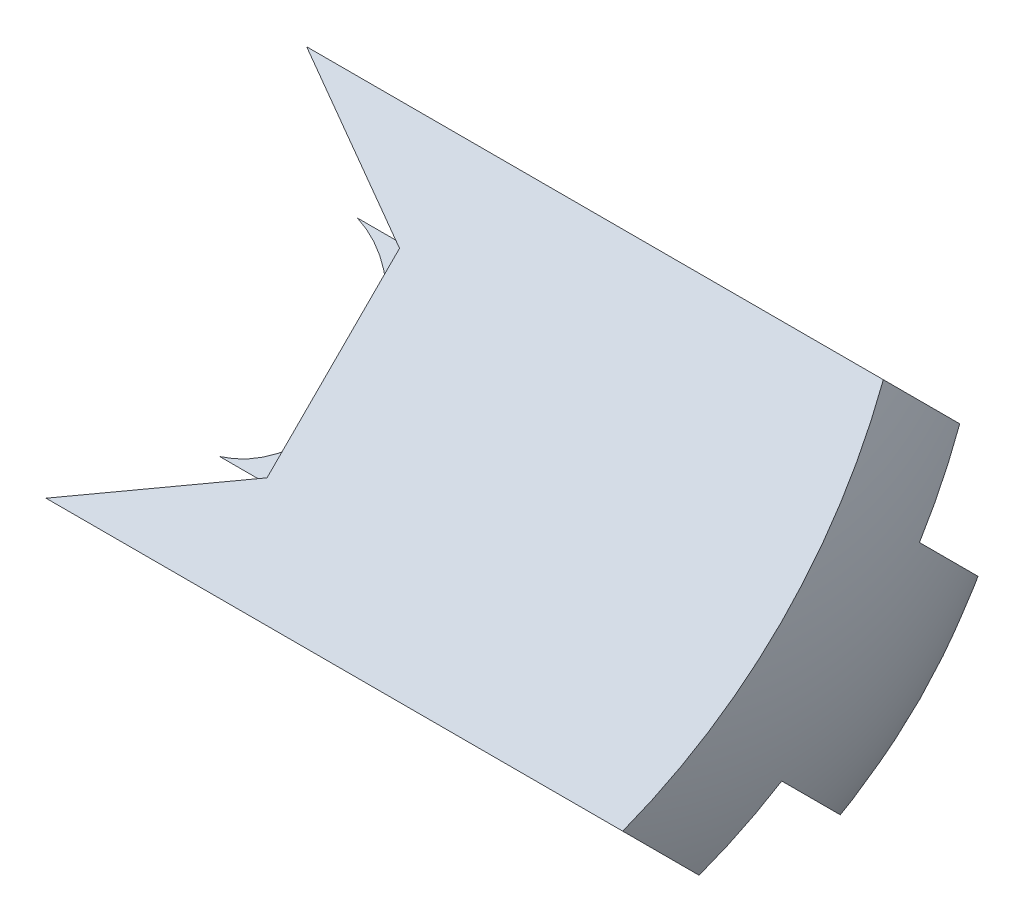
ISO-10303-21;
HEADER;
FILE_DESCRIPTION(('STEP AP214'),'2;1');
FILE_NAME('part.step','',(''),(''),'','','');
FILE_SCHEMA(('AUTOMOTIVE_DESIGN { 1 0 10303 214 1 1 1 1 }'));
ENDSEC;
DATA;
#1=APPLICATION_CONTEXT('core data for automotive mechanical design processes');
#2=APPLICATION_PROTOCOL_DEFINITION('international standard','automotive_design',2000,#1);
#3=PRODUCT_CONTEXT('',#1,'mechanical');
#4=PRODUCT('Part','Part','',(#3));
#5=PRODUCT_RELATED_PRODUCT_CATEGORY('part','',(#4));
#6=PRODUCT_DEFINITION_FORMATION('','',#4);
#7=PRODUCT_DEFINITION_CONTEXT('part definition',#1,'design');
#8=PRODUCT_DEFINITION('design','',#6,#7);
#9=PRODUCT_DEFINITION_SHAPE('','',#8);
#10=(LENGTH_UNIT() NAMED_UNIT(*) SI_UNIT(.MILLI.,.METRE.));
#11=(NAMED_UNIT(*) PLANE_ANGLE_UNIT() SI_UNIT($,.RADIAN.));
#12=(NAMED_UNIT(*) SI_UNIT($,.STERADIAN.) SOLID_ANGLE_UNIT());
#13=UNCERTAINTY_MEASURE_WITH_UNIT(LENGTH_MEASURE(1.E-05),#10,'distance_accuracy_value','');
#14=(GEOMETRIC_REPRESENTATION_CONTEXT(3) GLOBAL_UNCERTAINTY_ASSIGNED_CONTEXT((#13)) GLOBAL_UNIT_ASSIGNED_CONTEXT((#10,
#11,#12)) REPRESENTATION_CONTEXT('',''));
#15=CARTESIAN_POINT('',(0.,0.,0.));
#16=DIRECTION('',(0.,0.,1.));
#17=DIRECTION('',(1.,0.,0.));
#18=AXIS2_PLACEMENT_3D('',#15,#16,#17);
#19=CARTESIAN_POINT('',(-65.,-21.4342694425522,-76.0704710401193));
#20=DIRECTION('',(0.,1.,0.));
#21=DIRECTION('',(0.,0.,1.));
#22=AXIS2_PLACEMENT_3D('',#19,#20,#21);
#23=SPHERICAL_SURFACE('',#22,19.75);
#24=CARTESIAN_POINT('',(-65.,-19.2068830818146,-78.2978574008569));
#25=DIRECTION('',(0.,-0.707106781186544,0.707106781186551));
#26=DIRECTION('',(0.,-0.707106781186551,-0.707106781186544));
#27=AXIS2_PLACEMENT_3D('',#24,#25,#26);
#28=CIRCLE('',#27,19.4971792831681);
#29=CARTESIAN_POINT('',(-45.9496063032808,-22.1413762237388,-81.2323505427811));
#30=VERTEX_POINT('',#29);
#31=CARTESIAN_POINT('',(-62.8725245130072,-32.9111497176519,-92.0021240366941));
#32=VERTEX_POINT('',#31);
#33=EDGE_CURVE('E196',#30,#32,#28,.F.);
#34=ORIENTED_EDGE('',*,*,#33,.F.);
#35=CARTESIAN_POINT('',(-65.,-24.3687625844764,-79.0049641820434));
#36=DIRECTION('',(0.,0.707106781186554,0.707106781186541));
#37=DIRECTION('',(0.,-0.707106781186541,0.707106781186554));
#38=AXIS2_PLACEMENT_3D('',#35,#36,#37);
#39=CIRCLE('',#38,19.3090652285397);
#40=CARTESIAN_POINT('',(-46.6344769863394,-20.1528662127245,-83.2208605537954));
#41=VERTEX_POINT('',#40);
#42=EDGE_CURVE('E240',#41,#30,#39,.F.);
#43=ORIENTED_EDGE('',*,*,#42,.F.);
#44=CARTESIAN_POINT('',(-65.,-17.2183730708003,-80.2863674118712));
#45=DIRECTION('',(0.,-0.707106781186543,0.707106781186552));
#46=DIRECTION('',(0.,-0.707106781186552,-0.707106781186543));
#47=AXIS2_PLACEMENT_3D('',#44,#45,#46);
#48=CIRCLE('',#47,18.8285670077491);
#49=CARTESIAN_POINT('',(-46.1714329922509,-17.2183730708004,-80.2863674118712));
#50=VERTEX_POINT('',#49);
#51=EDGE_CURVE('E148',#50,#41,#48,.F.);
#52=ORIENTED_EDGE('',*,*,#51,.F.);
#53=CARTESIAN_POINT('',(-65.,-21.4342694425522,-76.0704710401193));
#54=DIRECTION('',(0.,0.707106781186551,0.707106781186544));
#55=DIRECTION('',(0.,-0.707106781186544,0.707106781186551));
#56=AXIS2_PLACEMENT_3D('',#53,#54,#55);
#57=CIRCLE('',#56,19.75);
#58=CARTESIAN_POINT('',(-46.1714329922509,-25.6501658143042,-71.8545746683674));
#59=VERTEX_POINT('',#58);
#60=EDGE_CURVE('E130',#50,#59,#57,.F.);
#61=ORIENTED_EDGE('',*,*,#60,.T.);
#62=CARTESIAN_POINT('',(-65.,-25.6501658143043,-71.8545746683676));
#63=DIRECTION('',(0.,0.707106781186582,-0.707106781186513));
#64=DIRECTION('',(0.,0.707106781186513,0.707106781186582));
#65=AXIS2_PLACEMENT_3D('',#62,#63,#64);
#66=CIRCLE('',#65,18.8285670077491);
#67=CARTESIAN_POINT('',(-46.6344769863394,-28.5846589562283,-74.7890678102915));
#68=VERTEX_POINT('',#67);
#69=EDGE_CURVE('E137',#68,#59,#66,.F.);
#70=ORIENTED_EDGE('',*,*,#69,.F.);
#71=CARTESIAN_POINT('',(-65.,-24.3687625844764,-79.0049641820435));
#72=DIRECTION('',(0.,0.70710678118655,0.707106781186545));
#73=DIRECTION('',(0.,-0.707106781186545,0.70710678118655));
#74=AXIS2_PLACEMENT_3D('',#71,#72,#73);
#75=CIRCLE('',#74,19.3090652285397);
#76=CARTESIAN_POINT('',(-45.9496063032808,-26.596148945214,-76.7775778213058));
#77=VERTEX_POINT('',#76);
#78=EDGE_CURVE('E194',#77,#68,#75,.F.);
#79=ORIENTED_EDGE('',*,*,#78,.F.);
#80=CARTESIAN_POINT('',(-65.,-23.6616558032898,-73.8430846793816));
#81=DIRECTION('',(0.,0.707106781186544,-0.707106781186551));
#82=DIRECTION('',(0.,0.707106781186551,0.707106781186544));
#83=AXIS2_PLACEMENT_3D('',#80,#81,#82);
#84=CIRCLE('',#83,19.4971792831681);
#85=CARTESIAN_POINT('',(-62.8725245130072,-37.3659224391272,-87.5473513152188));
#86=VERTEX_POINT('',#85);
#87=EDGE_CURVE('E192',#86,#77,#84,.F.);
#88=ORIENTED_EDGE('',*,*,#87,.F.);
#89=CARTESIAN_POINT('',(-65.,-24.5353909583156,-73.2813832565147));
#90=DIRECTION('',(0.,0.74352318851626,-0.668710152561342));
#91=DIRECTION('',(0.,0.668710152561342,0.74352318851626));
#92=AXIS2_PLACEMENT_3D('',#89,#90,#91);
#93=CIRCLE('',#92,19.3045728955555);
#94=CARTESIAN_POINT('',(-64.1794232667012,-37.4328872203387,-87.6218078902446));
#95=VERTEX_POINT('',#94);
#96=EDGE_CURVE('E181',#95,#86,#93,.F.);
#97=ORIENTED_EDGE('',*,*,#96,.F.);
#98=CARTESIAN_POINT('',(-65.,-35.2092467565082,-89.8454483540751));
#99=DIRECTION('',(0.,-0.707106781186551,-0.707106781186544));
#100=DIRECTION('',(0.,0.707106781186544,-0.707106781186551));
#101=AXIS2_PLACEMENT_3D('',#98,#99,#100);
#102=CIRCLE('',#101,3.25000000000001);
#103=CARTESIAN_POINT('',(-64.1780969436501,-32.9858512264728,-92.0688438841105));
#104=VERTEX_POINT('',#103);
#105=EDGE_CURVE('E176',#95,#104,#102,.F.);
#106=ORIENTED_EDGE('',*,*,#105,.T.);
#107=CARTESIAN_POINT('',(-65.,-18.6117843604188,-79.2306085767642));
#108=DIRECTION('',(0.,-0.666138377099837,0.745828172272136));
#109=DIRECTION('',(0.,-0.745828172272136,-0.666138377099837));
#110=AXIS2_PLACEMENT_3D('',#107,#108,#109);
#111=CIRCLE('',#110,19.2901427861647);
#112=EDGE_CURVE('E202',#32,#104,#111,.F.);
#113=ORIENTED_EDGE('',*,*,#112,.F.);
#114=EDGE_LOOP('',(#34,#43,#52,#61,#70,#79,#88,#97,#106,#113));
#115=FACE_BOUND('',#114,.T.);
#116=ADVANCED_FACE('F35',(#115),#23,.T.);
#117=CARTESIAN_POINT('',(-65.,-41.1842694425523,-95.8204710401192));
#118=DIRECTION('',(0.,0.707106781186551,0.707106781186544));
#119=DIRECTION('',(0.,0.707106781186544,-0.707106781186551));
#120=AXIS2_PLACEMENT_3D('',#117,#118,#119);
#121=CYLINDRICAL_SURFACE('',#120,3.25000000000001);
#122=CARTESIAN_POINT('',(-65.,-74.6040037344345,-129.240205332001));
#123=DIRECTION('',(0.,-0.666138377099837,0.745828172272136));
#124=DIRECTION('',(0.,0.745828172272136,0.666138377099837));
#125=AXIS2_PLACEMENT_3D('',#122,#123,#124);
#126=ELLIPSE('',#125,57.6760684071963,3.25000000000001);
#127=CARTESIAN_POINT('',(-64.2,-32.9111497176519,-92.0021240366941));
#128=VERTEX_POINT('',#127);
#129=EDGE_CURVE('E11',#128,#104,#126,.F.);
#130=ORIENTED_EDGE('',*,*,#129,.T.);
#131=ORIENTED_EDGE('',*,*,#105,.F.);
#132=CARTESIAN_POINT('',(-65.,-77.1845410552546,-131.820742652821));
#133=DIRECTION('',(0.,0.74352318851626,-0.668710152561342));
#134=DIRECTION('',(0.,0.668710152561342,0.74352318851626));
#135=AXIS2_PLACEMENT_3D('',#132,#133,#134);
#136=ELLIPSE('',#135,61.4357380240756,3.25000000000001);
#137=CARTESIAN_POINT('',(-64.2,-37.3659224391272,-87.5473513152188));
#138=VERTEX_POINT('',#137);
#139=EDGE_CURVE('E42',#95,#138,#136,.F.);
#140=ORIENTED_EDGE('',*,*,#139,.T.);
#141=DIRECTION('',(0.,0.707106781186551,0.707106781186544));
#142=VECTOR('',#141,1.);
#143=CARTESIAN_POINT('',(-64.2,-43.4116558032899,-93.5930846793815));
#144=LINE('',#143,#142);
#145=CARTESIAN_POINT('',(-64.1999999999999,-26.6668596233327,-76.8482884994245));
#146=VERTEX_POINT('',#145);
#147=EDGE_CURVE('E174',#138,#146,#144,.T.);
#148=ORIENTED_EDGE('',*,*,#147,.T.);
#149=CARTESIAN_POINT('',(-65.,-24.4394732625951,-79.0756748601621));
#150=DIRECTION('',(0.,-0.707106781186552,-0.707106781186543));
#151=DIRECTION('',(0.,0.707106781186543,-0.707106781186552));
#152=AXIS2_PLACEMENT_3D('',#149,#150,#151);
#153=CIRCLE('',#152,3.25000000000001);
#154=CARTESIAN_POINT('',(-64.1999999999999,-22.2120869018575,-81.3030612208997));
#155=VERTEX_POINT('',#154);
#156=EDGE_CURVE('E205',#155,#146,#153,.T.);
#157=ORIENTED_EDGE('',*,*,#156,.F.);
#158=DIRECTION('',(0.,0.707106781186551,0.707106781186544));
#159=VECTOR('',#158,1.);
#160=CARTESIAN_POINT('',(-64.2,-38.9568830818147,-98.0478574008568));
#161=LINE('',#160,#159);
#162=EDGE_CURVE('E246',#155,#128,#161,.F.);
#163=ORIENTED_EDGE('',*,*,#162,.T.);
#164=EDGE_LOOP('',(#130,#131,#140,#148,#157,#163));
#165=FACE_BOUND('',#164,.T.);
#166=ADVANCED_FACE('F171',(#165),#121,.F.);
#167=CARTESIAN_POINT('',(0.,-51.7575740613788,-51.7575740613781));
#168=DIRECTION('',(0.,0.707106781186552,0.707106781186543));
#169=DIRECTION('',(0.,0.707106781186543,-0.707106781186552));
#170=AXIS2_PLACEMENT_3D('',#167,#168,#169);
#171=PLANE('',#170);
#172=ORIENTED_EDGE('',*,*,#156,.T.);
#173=DIRECTION('',(-1.,0.,0.));
#174=VECTOR('',#173,1.);
#175=CARTESIAN_POINT('',(0.,-26.6668596233327,-76.8482884994245));
#176=LINE('',#175,#174);
#177=CARTESIAN_POINT('',(-59.9559600438419,-26.6668596233327,-76.8482884994245));
#178=VERTEX_POINT('',#177);
#179=EDGE_CURVE('E190',#178,#146,#176,.T.);
#180=ORIENTED_EDGE('',*,*,#179,.F.);
#181=DIRECTION('',(-0.866025403784439,-0.353553390593271,0.353553390593277));
#182=VECTOR('',#181,1.);
#183=CARTESIAN_POINT('',(-59.75,-26.5827767875304,-76.9323713352268));
#184=LINE('',#183,#182);
#185=CARTESIAN_POINT('',(-59.75,-26.5827767875304,-76.9323713352268));
#186=VERTEX_POINT('',#185);
#187=EDGE_CURVE('E208',#186,#178,#184,.T.);
#188=ORIENTED_EDGE('',*,*,#187,.F.);
#189=DIRECTION('',(0.,-0.707106781186545,0.70710678118655));
#190=VECTOR('',#189,1.);
#191=CARTESIAN_POINT('',(-59.75,-22.2961697376598,-81.2189783850974));
#192=LINE('',#191,#190);
#193=CARTESIAN_POINT('',(-59.75,-22.2961697376598,-81.2189783850974));
#194=VERTEX_POINT('',#193);
#195=EDGE_CURVE('E215',#194,#186,#192,.T.);
#196=ORIENTED_EDGE('',*,*,#195,.F.);
#197=DIRECTION('',(0.866025403784439,-0.353553390593271,0.353553390593275));
#198=VECTOR('',#197,1.);
#199=CARTESIAN_POINT('',(-65.,-20.1528662127245,-83.3622819100327));
#200=LINE('',#199,#198);
#201=CARTESIAN_POINT('',(-59.955960043842,-22.2120869018575,-81.3030612208997));
#202=VERTEX_POINT('',#201);
#203=EDGE_CURVE('E211',#202,#194,#200,.T.);
#204=ORIENTED_EDGE('',*,*,#203,.F.);
#205=DIRECTION('',(1.,0.,0.));
#206=VECTOR('',#205,1.);
#207=CARTESIAN_POINT('',(0.,-22.2120869018575,-81.3030612208998));
#208=LINE('',#207,#206);
#209=EDGE_CURVE('E243',#155,#202,#208,.T.);
#210=ORIENTED_EDGE('',*,*,#209,.F.);
#211=EDGE_LOOP('',(#172,#180,#188,#196,#204,#210));
#212=FACE_BOUND('',#211,.T.);
#213=ADVANCED_FACE('F259',(#212),#171,.T.);
#214=CARTESIAN_POINT('',(-59.75,-26.5827767875304,-76.9323713352268));
#215=DIRECTION('',(0.5,-0.612372435695791,0.612372435695798));
#216=DIRECTION('',(0.,0.707106781186551,0.707106781186544));
#217=AXIS2_PLACEMENT_3D('',#214,#215,#216);
#218=PLANE('',#217);
#219=DIRECTION('',(0.,0.707106781186513,0.707106781186582));
#220=VECTOR('',#219,1.);
#221=CARTESIAN_POINT('',(-64.8267949192427,-28.6553696343473,-74.8597784884108));
#222=LINE('',#221,#220);
#223=CARTESIAN_POINT('',(-64.8267949192431,-28.5846589562283,-74.7890678102915));
#224=VERTEX_POINT('',#223);
#225=CARTESIAN_POINT('',(-64.8267949192431,-25.6501658143041,-71.8545746683673));
#226=VERTEX_POINT('',#225);
#227=EDGE_CURVE('E144',#224,#226,#222,.T.);
#228=ORIENTED_EDGE('',*,*,#227,.T.);
#229=DIRECTION('',(-0.866025403784439,-0.353553390593271,0.353553390593277));
#230=VECTOR('',#229,1.);
#231=CARTESIAN_POINT('',(-59.75,-23.5775729674875,-73.927167515184));
#232=LINE('',#231,#230);
#233=CARTESIAN_POINT('',(-59.75,-23.5775729674875,-73.927167515184));
#234=VERTEX_POINT('',#233);
#235=EDGE_CURVE('E133',#234,#226,#232,.T.);
#236=ORIENTED_EDGE('',*,*,#235,.F.);
#237=DIRECTION('',(0.,0.707106781186551,0.707106781186544));
#238=VECTOR('',#237,1.);
#239=CARTESIAN_POINT('',(-59.75,-26.5827767875304,-76.9323713352268));
#240=LINE('',#239,#238);
#241=EDGE_CURVE('E149',#186,#234,#240,.T.);
#242=ORIENTED_EDGE('',*,*,#241,.F.);
#243=ORIENTED_EDGE('',*,*,#187,.T.);
#244=DIRECTION('',(0.,0.707106781186551,0.707106781186544));
#245=VECTOR('',#244,1.);
#246=CARTESIAN_POINT('',(-59.9559600438419,-26.6668596233327,-76.8482884994245));
#247=LINE('',#246,#245);
#248=CARTESIAN_POINT('',(-59.9559600438419,-26.596148945214,-76.7775778213058));
#249=VERTEX_POINT('',#248);
#250=EDGE_CURVE('E162',#178,#249,#247,.T.);
#251=ORIENTED_EDGE('',*,*,#250,.T.);
#252=DIRECTION('',(-0.866025403784439,-0.353553390593273,0.353553390593275));
#253=VECTOR('',#252,1.);
#254=CARTESIAN_POINT('',(-59.75,-26.5120661094117,-76.8616606571081));
#255=LINE('',#254,#253);
#256=EDGE_CURVE('E165',#249,#224,#255,.T.);
#257=ORIENTED_EDGE('',*,*,#256,.T.);
#258=EDGE_LOOP('',(#228,#236,#242,#243,#251,#257));
#259=FACE_BOUND('',#258,.T.);
#260=ADVANCED_FACE('F229',(#259),#218,.F.);
#261=CARTESIAN_POINT('',(-65.,-20.1528662127245,-83.3622819100327));
#262=DIRECTION('',(0.499999999999999,0.612372435695791,-0.612372435695798));
#263=DIRECTION('',(0.,-0.707106781186551,-0.707106781186544));
#264=AXIS2_PLACEMENT_3D('',#261,#262,#263);
#265=PLANE('',#264);
#266=DIRECTION('',(0.,-0.707106781186551,-0.707106781186544));
#267=VECTOR('',#266,1.);
#268=CARTESIAN_POINT('',(-59.955960043842,-22.2120869018575,-81.3030612208997));
#269=LINE('',#268,#267);
#270=CARTESIAN_POINT('',(-59.955960043842,-22.1413762237388,-81.2323505427811));
#271=VERTEX_POINT('',#270);
#272=EDGE_CURVE('E160',#271,#202,#269,.T.);
#273=ORIENTED_EDGE('',*,*,#272,.T.);
#274=ORIENTED_EDGE('',*,*,#203,.T.);
#275=DIRECTION('',(0.,0.707106781186551,0.707106781186544));
#276=VECTOR('',#275,1.);
#277=CARTESIAN_POINT('',(-59.75,-22.2961697376598,-81.2189783850974));
#278=LINE('',#277,#276);
#279=CARTESIAN_POINT('',(-59.75,-19.290965917617,-78.2137745650546));
#280=VERTEX_POINT('',#279);
#281=EDGE_CURVE('E152',#194,#280,#278,.T.);
#282=ORIENTED_EDGE('',*,*,#281,.T.);
#283=DIRECTION('',(0.866025403784439,-0.353553390593271,0.353553390593275));
#284=VECTOR('',#283,1.);
#285=CARTESIAN_POINT('',(-65.,-17.1476623926817,-80.3570780899899));
#286=LINE('',#285,#284);
#287=CARTESIAN_POINT('',(-64.8267949192431,-17.2183730708004,-80.2863674118712));
#288=VERTEX_POINT('',#287);
#289=EDGE_CURVE('E219',#288,#280,#286,.T.);
#290=ORIENTED_EDGE('',*,*,#289,.F.);
#291=DIRECTION('',(0.,-0.707106781186552,-0.707106781186543));
#292=VECTOR('',#291,1.);
#293=CARTESIAN_POINT('',(-64.8267949192431,-20.2235768908432,-83.291571231914));
#294=LINE('',#293,#292);
#295=CARTESIAN_POINT('',(-64.8267949192431,-20.1528662127245,-83.2208605537954));
#296=VERTEX_POINT('',#295);
#297=EDGE_CURVE('E143',#288,#296,#294,.T.);
#298=ORIENTED_EDGE('',*,*,#297,.T.);
#299=DIRECTION('',(0.866025403784439,-0.35355339059327,0.353553390593277));
#300=VECTOR('',#299,1.);
#301=CARTESIAN_POINT('',(-65.,-20.0821555346059,-83.291571231914));
#302=LINE('',#301,#300);
#303=EDGE_CURVE('E157',#296,#271,#302,.T.);
#304=ORIENTED_EDGE('',*,*,#303,.T.);
#305=EDGE_LOOP('',(#273,#274,#282,#290,#298,#304));
#306=FACE_BOUND('',#305,.T.);
#307=ADVANCED_FACE('F261',(#306),#265,.F.);
#308=CARTESIAN_POINT('',(-45.25,-17.1476623926817,-80.3570780899899));
#309=DIRECTION('',(0.,-0.707106781186551,-0.707106781186544));
#310=DIRECTION('',(0.,-0.707106781186544,0.707106781186551));
#311=AXIS2_PLACEMENT_3D('',#308,#309,#310);
#312=PLANE('',#311);
#313=DIRECTION('',(-1.,0.,0.));
#314=VECTOR('',#313,1.);
#315=CARTESIAN_POINT('',(-45.25,-17.2183730708004,-80.2863674118712));
#316=LINE('',#315,#314);
#317=EDGE_CURVE('E57',#50,#288,#316,.T.);
#318=ORIENTED_EDGE('',*,*,#317,.T.);
#319=ORIENTED_EDGE('',*,*,#289,.T.);
#320=DIRECTION('',(0.,-0.707106781186545,0.70710678118655));
#321=VECTOR('',#320,1.);
#322=CARTESIAN_POINT('',(-59.75,-19.290965917617,-78.2137745650546));
#323=LINE('',#322,#321);
#324=EDGE_CURVE('E212',#280,#234,#323,.T.);
#325=ORIENTED_EDGE('',*,*,#324,.T.);
#326=ORIENTED_EDGE('',*,*,#235,.T.);
#327=DIRECTION('',(1.,0.,0.));
#328=VECTOR('',#327,1.);
#329=CARTESIAN_POINT('',(-45.25,-25.6501658143041,-71.8545746683673));
#330=LINE('',#329,#328);
#331=EDGE_CURVE('E49',#226,#59,#330,.T.);
#332=ORIENTED_EDGE('',*,*,#331,.T.);
#333=ORIENTED_EDGE('',*,*,#60,.F.);
#334=EDGE_LOOP('',(#318,#319,#325,#326,#332,#333));
#335=FACE_BOUND('',#334,.T.);
#336=ADVANCED_FACE('F128',(#335),#312,.F.);
#337=CARTESIAN_POINT('',(-59.75,-22.2961697376598,-81.2189783850974));
#338=DIRECTION('',(1.,0.,0.));
#339=DIRECTION('',(0.,0.,1.));
#340=AXIS2_PLACEMENT_3D('',#337,#338,#339);
#341=PLANE('',#340);
#342=ORIENTED_EDGE('',*,*,#324,.F.);
#343=ORIENTED_EDGE('',*,*,#281,.F.);
#344=ORIENTED_EDGE('',*,*,#195,.T.);
#345=ORIENTED_EDGE('',*,*,#241,.T.);
#346=EDGE_LOOP('',(#342,#343,#344,#345));
#347=FACE_BOUND('',#346,.T.);
#348=ADVANCED_FACE('F225',(#347),#341,.F.);
#349=CARTESIAN_POINT('',(-65.,-25.7208764924228,-71.925285346486));
#350=DIRECTION('',(0.,-0.707106781186582,0.707106781186513));
#351=DIRECTION('',(0.,0.707106781186513,0.707106781186582));
#352=AXIS2_PLACEMENT_3D('',#349,#350,#351);
#353=PLANE('',#352);
#354=DIRECTION('',(1.,0.,0.));
#355=VECTOR('',#354,1.);
#356=CARTESIAN_POINT('',(-65.,-28.5846589562283,-74.7890678102915));
#357=LINE('',#356,#355);
#358=EDGE_CURVE('E139',#224,#68,#357,.T.);
#359=ORIENTED_EDGE('',*,*,#358,.T.);
#360=ORIENTED_EDGE('',*,*,#69,.T.);
#361=ORIENTED_EDGE('',*,*,#331,.F.);
#362=ORIENTED_EDGE('',*,*,#227,.F.);
#363=EDGE_LOOP('',(#359,#360,#361,#362));
#364=FACE_BOUND('',#363,.T.);
#365=ADVANCED_FACE('F138',(#364),#353,.T.);
#366=CARTESIAN_POINT('',(-65.,-37.3659224391272,-87.5473513152188));
#367=DIRECTION('',(0.,-0.707106781186544,0.707106781186551));
#368=DIRECTION('',(0.,0.707106781186551,0.707106781186544));
#369=AXIS2_PLACEMENT_3D('',#366,#367,#368);
#370=PLANE('',#369);
#371=DIRECTION('',(1.,0.,0.));
#372=VECTOR('',#371,1.);
#373=CARTESIAN_POINT('',(-65.,-37.3659224391272,-87.5473513152188));
#374=LINE('',#373,#372);
#375=EDGE_CURVE('E183',#138,#86,#374,.T.);
#376=ORIENTED_EDGE('',*,*,#375,.T.);
#377=ORIENTED_EDGE('',*,*,#87,.T.);
#378=DIRECTION('',(1.,0.,0.));
#379=VECTOR('',#378,1.);
#380=CARTESIAN_POINT('',(-65.,-26.596148945214,-76.7775778213058));
#381=LINE('',#380,#379);
#382=EDGE_CURVE('E186',#249,#77,#381,.T.);
#383=ORIENTED_EDGE('',*,*,#382,.F.);
#384=ORIENTED_EDGE('',*,*,#250,.F.);
#385=ORIENTED_EDGE('',*,*,#179,.T.);
#386=ORIENTED_EDGE('',*,*,#147,.F.);
#387=EDGE_LOOP('',(#376,#377,#383,#384,#385,#386));
#388=FACE_BOUND('',#387,.T.);
#389=ADVANCED_FACE('F188',(#388),#370,.T.);
#390=CARTESIAN_POINT('',(-65.,-26.596148945214,-76.7775778213058));
#391=DIRECTION('',(0.,-0.70710678118655,-0.707106781186545));
#392=DIRECTION('',(0.,-0.707106781186545,0.70710678118655));
#393=AXIS2_PLACEMENT_3D('',#390,#391,#392);
#394=PLANE('',#393);
#395=ORIENTED_EDGE('',*,*,#382,.T.);
#396=ORIENTED_EDGE('',*,*,#78,.T.);
#397=ORIENTED_EDGE('',*,*,#358,.F.);
#398=ORIENTED_EDGE('',*,*,#256,.F.);
#399=EDGE_LOOP('',(#395,#396,#397,#398));
#400=FACE_BOUND('',#399,.T.);
#401=ADVANCED_FACE('F270',(#400),#394,.T.);
#402=CARTESIAN_POINT('',(-65.,-37.3659224391272,-87.5473513152188));
#403=DIRECTION('',(0.,-0.74352318851626,0.668710152561342));
#404=DIRECTION('',(0.,0.668710152561342,0.74352318851626));
#405=AXIS2_PLACEMENT_3D('',#402,#403,#404);
#406=PLANE('',#405);
#407=ORIENTED_EDGE('',*,*,#139,.F.);
#408=ORIENTED_EDGE('',*,*,#96,.T.);
#409=ORIENTED_EDGE('',*,*,#375,.F.);
#410=EDGE_LOOP('',(#407,#408,#409));
#411=FACE_BOUND('',#410,.T.);
#412=ADVANCED_FACE('F180',(#411),#406,.T.);
#413=CARTESIAN_POINT('',(-65.,-22.1413762237388,-81.2323505427811));
#414=DIRECTION('',(0.,0.707106781186544,-0.707106781186551));
#415=DIRECTION('',(0.,-0.707106781186551,-0.707106781186544));
#416=AXIS2_PLACEMENT_3D('',#413,#414,#415);
#417=PLANE('',#416);
#418=DIRECTION('',(1.,0.,0.));
#419=VECTOR('',#418,1.);
#420=CARTESIAN_POINT('',(-65.,-22.1413762237388,-81.2323505427811));
#421=LINE('',#420,#419);
#422=EDGE_CURVE('E233',#271,#30,#421,.T.);
#423=ORIENTED_EDGE('',*,*,#422,.T.);
#424=ORIENTED_EDGE('',*,*,#33,.T.);
#425=DIRECTION('',(1.,0.,0.));
#426=VECTOR('',#425,1.);
#427=CARTESIAN_POINT('',(-65.,-32.9111497176519,-92.0021240366941));
#428=LINE('',#427,#426);
#429=EDGE_CURVE('E231',#128,#32,#428,.T.);
#430=ORIENTED_EDGE('',*,*,#429,.F.);
#431=ORIENTED_EDGE('',*,*,#162,.F.);
#432=ORIENTED_EDGE('',*,*,#209,.T.);
#433=ORIENTED_EDGE('',*,*,#272,.F.);
#434=EDGE_LOOP('',(#423,#424,#430,#431,#432,#433));
#435=FACE_BOUND('',#434,.T.);
#436=ADVANCED_FACE('F250',(#435),#417,.T.);
#437=CARTESIAN_POINT('',(-65.,-20.1528662127245,-83.2208605537954));
#438=DIRECTION('',(0.,-0.707106781186554,-0.707106781186541));
#439=DIRECTION('',(0.,-0.707106781186541,0.707106781186554));
#440=AXIS2_PLACEMENT_3D('',#437,#438,#439);
#441=PLANE('',#440);
#442=DIRECTION('',(1.,0.,0.));
#443=VECTOR('',#442,1.);
#444=CARTESIAN_POINT('',(-65.,-20.1528662127245,-83.2208605537954));
#445=LINE('',#444,#443);
#446=EDGE_CURVE('E265',#296,#41,#445,.T.);
#447=ORIENTED_EDGE('',*,*,#446,.T.);
#448=ORIENTED_EDGE('',*,*,#42,.T.);
#449=ORIENTED_EDGE('',*,*,#422,.F.);
#450=ORIENTED_EDGE('',*,*,#303,.F.);
#451=EDGE_LOOP('',(#447,#448,#449,#450));
#452=FACE_BOUND('',#451,.T.);
#453=ADVANCED_FACE('F264',(#452),#441,.T.);
#454=CARTESIAN_POINT('',(-65.,-17.289083748919,-80.3570780899899));
#455=DIRECTION('',(0.,0.707106781186543,-0.707106781186552));
#456=DIRECTION('',(0.,-0.707106781186552,-0.707106781186543));
#457=AXIS2_PLACEMENT_3D('',#454,#455,#456);
#458=PLANE('',#457);
#459=ORIENTED_EDGE('',*,*,#317,.F.);
#460=ORIENTED_EDGE('',*,*,#51,.T.);
#461=ORIENTED_EDGE('',*,*,#446,.F.);
#462=ORIENTED_EDGE('',*,*,#297,.F.);
#463=EDGE_LOOP('',(#459,#460,#461,#462));
#464=FACE_BOUND('',#463,.T.);
#465=ADVANCED_FACE('F348',(#464),#458,.T.);
#466=CARTESIAN_POINT('',(-65.,-32.9111497176519,-92.0021240366941));
#467=DIRECTION('',(0.,0.666138377099837,-0.745828172272136));
#468=DIRECTION('',(0.,-0.745828172272136,-0.666138377099837));
#469=AXIS2_PLACEMENT_3D('',#466,#467,#468);
#470=PLANE('',#469);
#471=ORIENTED_EDGE('',*,*,#429,.T.);
#472=ORIENTED_EDGE('',*,*,#112,.T.);
#473=ORIENTED_EDGE('',*,*,#129,.F.);
#474=EDGE_LOOP('',(#471,#472,#473));
#475=FACE_BOUND('',#474,.T.);
#476=ADVANCED_FACE('F256',(#475),#470,.T.);
#477=CLOSED_SHELL('',(#116,#166,#213,#260,#307,#336,#348,#365,#389,#401,#412,#436,#453,#465,#476));
#478=MANIFOLD_SOLID_BREP('B2',#477);
#479=ADVANCED_BREP_SHAPE_REPRESENTATION('',(#18,#478),#14);
#480=SHAPE_DEFINITION_REPRESENTATION(#9,#479);
ENDSEC;
END-ISO-10303-21;
